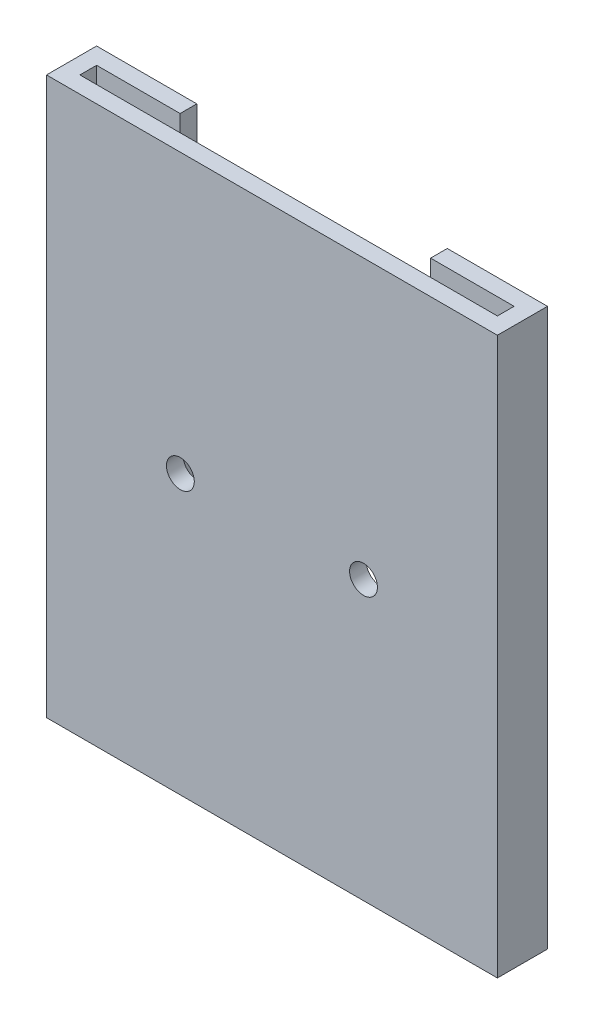
ISO-10303-21;
HEADER;
FILE_DESCRIPTION(('STEP AP214'),'2;1');
FILE_NAME('part.step','',(''),(''),'','','');
FILE_SCHEMA(('AUTOMOTIVE_DESIGN { 1 0 10303 214 1 1 1 1 }'));
ENDSEC;
DATA;
#1=APPLICATION_CONTEXT('core data for automotive mechanical design processes');
#2=APPLICATION_PROTOCOL_DEFINITION('international standard','automotive_design',2000,#1);
#3=PRODUCT_CONTEXT('',#1,'mechanical');
#4=PRODUCT('Part','Part','',(#3));
#5=PRODUCT_RELATED_PRODUCT_CATEGORY('part','',(#4));
#6=PRODUCT_DEFINITION_FORMATION('','',#4);
#7=PRODUCT_DEFINITION_CONTEXT('part definition',#1,'design');
#8=PRODUCT_DEFINITION('design','',#6,#7);
#9=PRODUCT_DEFINITION_SHAPE('','',#8);
#10=(LENGTH_UNIT() NAMED_UNIT(*) SI_UNIT(.MILLI.,.METRE.));
#11=(NAMED_UNIT(*) PLANE_ANGLE_UNIT() SI_UNIT($,.RADIAN.));
#12=(NAMED_UNIT(*) SI_UNIT($,.STERADIAN.) SOLID_ANGLE_UNIT());
#13=UNCERTAINTY_MEASURE_WITH_UNIT(LENGTH_MEASURE(1.E-05),#10,'distance_accuracy_value','');
#14=(GEOMETRIC_REPRESENTATION_CONTEXT(3) GLOBAL_UNCERTAINTY_ASSIGNED_CONTEXT((#13)) GLOBAL_UNIT_ASSIGNED_CONTEXT((#10,
#11,#12)) REPRESENTATION_CONTEXT('',''));
#15=CARTESIAN_POINT('',(0.,0.,0.));
#16=DIRECTION('',(0.,0.,1.));
#17=DIRECTION('',(1.,0.,0.));
#18=AXIS2_PLACEMENT_3D('',#15,#16,#17);
#19=CARTESIAN_POINT('',(-12.1747572815534,200.,0.));
#20=DIRECTION('',(1.,0.,0.));
#21=DIRECTION('',(0.,0.,-1.));
#22=AXIS2_PLACEMENT_3D('',#19,#20,#21);
#23=PLANE('',#22);
#24=DIRECTION('',(0.,0.,1.));
#25=VECTOR('',#24,1.);
#26=CARTESIAN_POINT('',(-12.1747572815534,0.,0.));
#27=LINE('',#26,#25);
#28=CARTESIAN_POINT('',(-12.1747572815534,0.,-6.));
#29=VERTEX_POINT('',#28);
#30=CARTESIAN_POINT('',(-12.1747572815534,0.,0.));
#31=VERTEX_POINT('',#30);
#32=EDGE_CURVE('E155',#29,#31,#27,.T.);
#33=ORIENTED_EDGE('',*,*,#32,.T.);
#34=DIRECTION('',(0.,-1.,0.));
#35=VECTOR('',#34,1.);
#36=CARTESIAN_POINT('',(-12.1747572815534,200.,0.));
#37=LINE('',#36,#35);
#38=CARTESIAN_POINT('',(-12.1747572815534,200.,0.));
#39=VERTEX_POINT('',#38);
#40=EDGE_CURVE('E11',#39,#31,#37,.T.);
#41=ORIENTED_EDGE('',*,*,#40,.F.);
#42=DIRECTION('',(0.,0.,1.));
#43=VECTOR('',#42,1.);
#44=CARTESIAN_POINT('',(-12.1747572815534,200.,0.));
#45=LINE('',#44,#43);
#46=CARTESIAN_POINT('',(-12.1747572815534,200.,-6.));
#47=VERTEX_POINT('',#46);
#48=EDGE_CURVE('E178',#47,#39,#45,.T.);
#49=ORIENTED_EDGE('',*,*,#48,.F.);
#50=DIRECTION('',(0.,-1.,0.));
#51=VECTOR('',#50,1.);
#52=CARTESIAN_POINT('',(-12.1747572815534,200.,-6.));
#53=LINE('',#52,#51);
#54=EDGE_CURVE('E151',#47,#29,#53,.T.);
#55=ORIENTED_EDGE('',*,*,#54,.T.);
#56=EDGE_LOOP('',(#33,#41,#49,#55));
#57=FACE_BOUND('',#56,.T.);
#58=ADVANCED_FACE('F35',(#57),#23,.F.);
#59=CARTESIAN_POINT('',(-12.1747572815534,200.,0.));
#60=DIRECTION('',(0.,0.,-1.));
#61=DIRECTION('',(-1.,0.,0.));
#62=AXIS2_PLACEMENT_3D('',#59,#60,#61);
#63=PLANE('',#62);
#64=DIRECTION('',(1.,0.,0.));
#65=VECTOR('',#64,1.);
#66=CARTESIAN_POINT('',(-12.1747572815534,0.,0.));
#67=LINE('',#66,#65);
#68=CARTESIAN_POINT('',(17.8252427184466,0.,0.));
#69=VERTEX_POINT('',#68);
#70=EDGE_CURVE('E158',#31,#69,#67,.T.);
#71=ORIENTED_EDGE('',*,*,#70,.T.);
#72=DIRECTION('',(0.,-1.,0.));
#73=VECTOR('',#72,1.);
#74=CARTESIAN_POINT('',(17.8252427184466,200.,0.));
#75=LINE('',#74,#73);
#76=CARTESIAN_POINT('',(17.8252427184466,200.,0.));
#77=VERTEX_POINT('',#76);
#78=EDGE_CURVE('E43',#77,#69,#75,.T.);
#79=ORIENTED_EDGE('',*,*,#78,.F.);
#80=DIRECTION('',(1.,0.,0.));
#81=VECTOR('',#80,1.);
#82=CARTESIAN_POINT('',(-12.1747572815534,200.,0.));
#83=LINE('',#82,#81);
#84=EDGE_CURVE('E106',#39,#77,#83,.T.);
#85=ORIENTED_EDGE('',*,*,#84,.F.);
#86=ORIENTED_EDGE('',*,*,#40,.T.);
#87=EDGE_LOOP('',(#71,#79,#85,#86));
#88=FACE_BOUND('',#87,.T.);
#89=ADVANCED_FACE('F256',(#88),#63,.F.);
#90=CARTESIAN_POINT('',(17.8252427184466,200.,0.));
#91=DIRECTION('',(1.,0.,0.));
#92=DIRECTION('',(0.,0.,-1.));
#93=AXIS2_PLACEMENT_3D('',#90,#91,#92);
#94=PLANE('',#93);
#95=DIRECTION('',(0.,0.,1.));
#96=VECTOR('',#95,1.);
#97=CARTESIAN_POINT('',(17.8252427184466,0.,0.));
#98=LINE('',#97,#96);
#99=CARTESIAN_POINT('',(17.8252427184466,0.,6.));
#100=VERTEX_POINT('',#99);
#101=EDGE_CURVE('E161',#69,#100,#98,.T.);
#102=ORIENTED_EDGE('',*,*,#101,.T.);
#103=DIRECTION('',(0.,-1.,0.));
#104=VECTOR('',#103,1.);
#105=CARTESIAN_POINT('',(17.8252427184466,200.,6.));
#106=LINE('',#105,#104);
#107=CARTESIAN_POINT('',(17.8252427184466,200.,6.));
#108=VERTEX_POINT('',#107);
#109=EDGE_CURVE('E197',#108,#100,#106,.T.);
#110=ORIENTED_EDGE('',*,*,#109,.F.);
#111=DIRECTION('',(0.,0.,1.));
#112=VECTOR('',#111,1.);
#113=CARTESIAN_POINT('',(17.8252427184466,200.,0.));
#114=LINE('',#113,#112);
#115=EDGE_CURVE('E205',#77,#108,#114,.T.);
#116=ORIENTED_EDGE('',*,*,#115,.F.);
#117=ORIENTED_EDGE('',*,*,#78,.T.);
#118=EDGE_LOOP('',(#102,#110,#116,#117));
#119=FACE_BOUND('',#118,.T.);
#120=ADVANCED_FACE('F203',(#119),#94,.F.);
#121=CARTESIAN_POINT('',(17.8252427184466,200.,6.));
#122=DIRECTION('',(0.,0.,1.));
#123=DIRECTION('',(1.,0.,0.));
#124=AXIS2_PLACEMENT_3D('',#121,#122,#123);
#125=PLANE('',#124);
#126=CARTESIAN_POINT('',(-24.2747572815534,100.,6.));
#127=DIRECTION('',(0.,0.,-1.));
#128=DIRECTION('',(-1.,0.,0.));
#129=AXIS2_PLACEMENT_3D('',#126,#127,#128);
#130=CIRCLE('',#129,5.);
#131=CARTESIAN_POINT('',(-29.2747572815534,100.,6.00000000000001));
#132=VERTEX_POINT('',#131);
#133=EDGE_CURVE('E293',#132,#132,#130,.T.);
#134=ORIENTED_EDGE('',*,*,#133,.F.);
#135=EDGE_LOOP('',(#134));
#136=FACE_BOUND('',#135,.T.);
#137=CARTESIAN_POINT('',(-90.0747572815533,100.,6.00000000000001));
#138=DIRECTION('',(0.,0.,-1.));
#139=DIRECTION('',(1.,0.,0.));
#140=AXIS2_PLACEMENT_3D('',#137,#138,#139);
#141=CIRCLE('',#140,5.00000000000001);
#142=CARTESIAN_POINT('',(-85.0747572815533,100.,6.00000000000001));
#143=VERTEX_POINT('',#142);
#144=EDGE_CURVE('E294',#143,#143,#141,.T.);
#145=ORIENTED_EDGE('',*,*,#144,.F.);
#146=EDGE_LOOP('',(#145));
#147=FACE_BOUND('',#146,.T.);
#148=DIRECTION('',(-1.,0.,0.));
#149=VECTOR('',#148,1.);
#150=CARTESIAN_POINT('',(17.8252427184466,0.,6.));
#151=LINE('',#150,#149);
#152=CARTESIAN_POINT('',(-132.174757281553,0.,6.00000000000002));
#153=VERTEX_POINT('',#152);
#154=EDGE_CURVE('E163',#100,#153,#151,.T.);
#155=ORIENTED_EDGE('',*,*,#154,.T.);
#156=DIRECTION('',(0.,-1.,0.));
#157=VECTOR('',#156,1.);
#158=CARTESIAN_POINT('',(-132.174757281553,200.,6.00000000000002));
#159=LINE('',#158,#157);
#160=CARTESIAN_POINT('',(-132.174757281553,200.,6.00000000000002));
#161=VERTEX_POINT('',#160);
#162=EDGE_CURVE('E194',#161,#153,#159,.T.);
#163=ORIENTED_EDGE('',*,*,#162,.F.);
#164=DIRECTION('',(-1.,0.,0.));
#165=VECTOR('',#164,1.);
#166=CARTESIAN_POINT('',(17.8252427184466,200.,6.));
#167=LINE('',#166,#165);
#168=EDGE_CURVE('E223',#108,#161,#167,.T.);
#169=ORIENTED_EDGE('',*,*,#168,.F.);
#170=ORIENTED_EDGE('',*,*,#109,.T.);
#171=EDGE_LOOP('',(#155,#163,#169,#170));
#172=FACE_BOUND('',#171,.T.);
#173=ADVANCED_FACE('F214',(#136,#147,#172),#125,.F.);
#174=CARTESIAN_POINT('',(-132.174757281553,200.,6.00000000000002));
#175=DIRECTION('',(-1.,0.,0.));
#176=DIRECTION('',(0.,0.,1.));
#177=AXIS2_PLACEMENT_3D('',#174,#175,#176);
#178=PLANE('',#177);
#179=DIRECTION('',(0.,0.,-1.));
#180=VECTOR('',#179,1.);
#181=CARTESIAN_POINT('',(-132.174757281553,0.,6.00000000000002));
#182=LINE('',#181,#180);
#183=CARTESIAN_POINT('',(-132.174757281553,0.,0.));
#184=VERTEX_POINT('',#183);
#185=EDGE_CURVE('E165',#153,#184,#182,.T.);
#186=ORIENTED_EDGE('',*,*,#185,.T.);
#187=DIRECTION('',(0.,-1.,0.));
#188=VECTOR('',#187,1.);
#189=CARTESIAN_POINT('',(-132.174757281553,200.,0.));
#190=LINE('',#189,#188);
#191=CARTESIAN_POINT('',(-132.174757281553,200.,0.));
#192=VERTEX_POINT('',#191);
#193=EDGE_CURVE('E191',#192,#184,#190,.T.);
#194=ORIENTED_EDGE('',*,*,#193,.F.);
#195=DIRECTION('',(0.,0.,-1.));
#196=VECTOR('',#195,1.);
#197=CARTESIAN_POINT('',(-132.174757281553,200.,6.00000000000002));
#198=LINE('',#197,#196);
#199=EDGE_CURVE('E220',#161,#192,#198,.T.);
#200=ORIENTED_EDGE('',*,*,#199,.F.);
#201=ORIENTED_EDGE('',*,*,#162,.T.);
#202=EDGE_LOOP('',(#186,#194,#200,#201));
#203=FACE_BOUND('',#202,.T.);
#204=ADVANCED_FACE('F218',(#203),#178,.F.);
#205=CARTESIAN_POINT('',(-102.174757281553,200.,0.));
#206=DIRECTION('',(0.,0.,-1.));
#207=DIRECTION('',(-1.,0.,0.));
#208=AXIS2_PLACEMENT_3D('',#205,#206,#207);
#209=PLANE('',#208);
#210=DIRECTION('',(1.,0.,0.));
#211=VECTOR('',#210,1.);
#212=CARTESIAN_POINT('',(-102.174757281553,0.,0.));
#213=LINE('',#212,#211);
#214=CARTESIAN_POINT('',(-102.174757281553,0.,0.));
#215=VERTEX_POINT('',#214);
#216=EDGE_CURVE('E167',#184,#215,#213,.T.);
#217=ORIENTED_EDGE('',*,*,#216,.T.);
#218=DIRECTION('',(0.,-1.,0.));
#219=VECTOR('',#218,1.);
#220=CARTESIAN_POINT('',(-102.174757281553,200.,0.));
#221=LINE('',#220,#219);
#222=CARTESIAN_POINT('',(-102.174757281553,200.,0.));
#223=VERTEX_POINT('',#222);
#224=EDGE_CURVE('E188',#223,#215,#221,.T.);
#225=ORIENTED_EDGE('',*,*,#224,.F.);
#226=DIRECTION('',(1.,0.,0.));
#227=VECTOR('',#226,1.);
#228=CARTESIAN_POINT('',(-102.174757281553,200.,0.));
#229=LINE('',#228,#227);
#230=EDGE_CURVE('E222',#192,#223,#229,.T.);
#231=ORIENTED_EDGE('',*,*,#230,.F.);
#232=ORIENTED_EDGE('',*,*,#193,.T.);
#233=EDGE_LOOP('',(#217,#225,#231,#232));
#234=FACE_BOUND('',#233,.T.);
#235=ADVANCED_FACE('F270',(#234),#209,.F.);
#236=CARTESIAN_POINT('',(-102.174757281553,200.,0.));
#237=DIRECTION('',(-1.,0.,0.));
#238=DIRECTION('',(0.,0.,1.));
#239=AXIS2_PLACEMENT_3D('',#236,#237,#238);
#240=PLANE('',#239);
#241=DIRECTION('',(0.,0.,-1.));
#242=VECTOR('',#241,1.);
#243=CARTESIAN_POINT('',(-102.174757281553,0.,0.));
#244=LINE('',#243,#242);
#245=CARTESIAN_POINT('',(-102.174757281553,0.,-6.));
#246=VERTEX_POINT('',#245);
#247=EDGE_CURVE('E169',#215,#246,#244,.T.);
#248=ORIENTED_EDGE('',*,*,#247,.T.);
#249=DIRECTION('',(0.,-1.,0.));
#250=VECTOR('',#249,1.);
#251=CARTESIAN_POINT('',(-102.174757281553,200.,-6.));
#252=LINE('',#251,#250);
#253=CARTESIAN_POINT('',(-102.174757281553,200.,-6.));
#254=VERTEX_POINT('',#253);
#255=EDGE_CURVE('E185',#254,#246,#252,.T.);
#256=ORIENTED_EDGE('',*,*,#255,.F.);
#257=DIRECTION('',(0.,0.,-1.));
#258=VECTOR('',#257,1.);
#259=CARTESIAN_POINT('',(-102.174757281553,200.,0.));
#260=LINE('',#259,#258);
#261=EDGE_CURVE('E225',#223,#254,#260,.T.);
#262=ORIENTED_EDGE('',*,*,#261,.F.);
#263=ORIENTED_EDGE('',*,*,#224,.T.);
#264=EDGE_LOOP('',(#248,#256,#262,#263));
#265=FACE_BOUND('',#264,.T.);
#266=ADVANCED_FACE('F273',(#265),#240,.F.);
#267=CARTESIAN_POINT('',(-102.174757281553,200.,-6.));
#268=DIRECTION('',(0.,0.,1.));
#269=DIRECTION('',(1.,0.,0.));
#270=AXIS2_PLACEMENT_3D('',#267,#268,#269);
#271=PLANE('',#270);
#272=DIRECTION('',(-1.,0.,0.));
#273=VECTOR('',#272,1.);
#274=CARTESIAN_POINT('',(-102.174757281553,0.,-6.));
#275=LINE('',#274,#273);
#276=CARTESIAN_POINT('',(-138.174757281553,0.,-6.));
#277=VERTEX_POINT('',#276);
#278=EDGE_CURVE('E171',#246,#277,#275,.T.);
#279=ORIENTED_EDGE('',*,*,#278,.T.);
#280=DIRECTION('',(0.,-1.,0.));
#281=VECTOR('',#280,1.);
#282=CARTESIAN_POINT('',(-138.174757281553,200.,-6.));
#283=LINE('',#282,#281);
#284=CARTESIAN_POINT('',(-138.174757281553,200.,-6.));
#285=VERTEX_POINT('',#284);
#286=EDGE_CURVE('E182',#285,#277,#283,.T.);
#287=ORIENTED_EDGE('',*,*,#286,.F.);
#288=DIRECTION('',(-1.,0.,0.));
#289=VECTOR('',#288,1.);
#290=CARTESIAN_POINT('',(-102.174757281553,200.,-6.));
#291=LINE('',#290,#289);
#292=EDGE_CURVE('E231',#254,#285,#291,.T.);
#293=ORIENTED_EDGE('',*,*,#292,.F.);
#294=ORIENTED_EDGE('',*,*,#255,.T.);
#295=EDGE_LOOP('',(#279,#287,#293,#294));
#296=FACE_BOUND('',#295,.T.);
#297=ADVANCED_FACE('F237',(#296),#271,.F.);
#298=CARTESIAN_POINT('',(-138.174757281553,200.,-6.));
#299=DIRECTION('',(1.,0.,0.));
#300=DIRECTION('',(0.,0.,-1.));
#301=AXIS2_PLACEMENT_3D('',#298,#299,#300);
#302=PLANE('',#301);
#303=DIRECTION('',(0.,0.,1.));
#304=VECTOR('',#303,1.);
#305=CARTESIAN_POINT('',(-138.174757281553,0.,-6.));
#306=LINE('',#305,#304);
#307=CARTESIAN_POINT('',(-138.174757281553,0.,12.));
#308=VERTEX_POINT('',#307);
#309=EDGE_CURVE('E173',#277,#308,#306,.T.);
#310=ORIENTED_EDGE('',*,*,#309,.T.);
#311=DIRECTION('',(0.,-1.,0.));
#312=VECTOR('',#311,1.);
#313=CARTESIAN_POINT('',(-138.174757281553,200.,12.));
#314=LINE('',#313,#312);
#315=CARTESIAN_POINT('',(-138.174757281553,200.,12.));
#316=VERTEX_POINT('',#315);
#317=EDGE_CURVE('E146',#316,#308,#314,.T.);
#318=ORIENTED_EDGE('',*,*,#317,.F.);
#319=DIRECTION('',(0.,0.,1.));
#320=VECTOR('',#319,1.);
#321=CARTESIAN_POINT('',(-138.174757281553,200.,-6.));
#322=LINE('',#321,#320);
#323=EDGE_CURVE('E137',#285,#316,#322,.T.);
#324=ORIENTED_EDGE('',*,*,#323,.F.);
#325=ORIENTED_EDGE('',*,*,#286,.T.);
#326=EDGE_LOOP('',(#310,#318,#324,#325));
#327=FACE_BOUND('',#326,.T.);
#328=ADVANCED_FACE('F241',(#327),#302,.F.);
#329=CARTESIAN_POINT('',(23.8252427184466,200.,12.));
#330=DIRECTION('',(0.,0.,-1.));
#331=DIRECTION('',(-1.,0.,0.));
#332=AXIS2_PLACEMENT_3D('',#329,#330,#331);
#333=PLANE('',#332);
#334=CARTESIAN_POINT('',(-24.2747572815534,100.,12.));
#335=DIRECTION('',(0.,0.,-1.));
#336=DIRECTION('',(-1.,0.,0.));
#337=AXIS2_PLACEMENT_3D('',#334,#335,#336);
#338=CIRCLE('',#337,5.);
#339=CARTESIAN_POINT('',(-29.2747572815534,100.,12.));
#340=VERTEX_POINT('',#339);
#341=EDGE_CURVE('E159',#340,#340,#338,.T.);
#342=ORIENTED_EDGE('',*,*,#341,.T.);
#343=EDGE_LOOP('',(#342));
#344=FACE_BOUND('',#343,.T.);
#345=CARTESIAN_POINT('',(-90.0747572815533,100.,12.));
#346=DIRECTION('',(0.,0.,-1.));
#347=DIRECTION('',(1.,0.,0.));
#348=AXIS2_PLACEMENT_3D('',#345,#346,#347);
#349=CIRCLE('',#348,5.00000000000001);
#350=CARTESIAN_POINT('',(-85.0747572815533,100.,12.));
#351=VERTEX_POINT('',#350);
#352=EDGE_CURVE('E291',#351,#351,#349,.T.);
#353=ORIENTED_EDGE('',*,*,#352,.T.);
#354=EDGE_LOOP('',(#353));
#355=FACE_BOUND('',#354,.T.);
#356=DIRECTION('',(1.,0.,0.));
#357=VECTOR('',#356,1.);
#358=CARTESIAN_POINT('',(23.8252427184466,0.,12.));
#359=LINE('',#358,#357);
#360=CARTESIAN_POINT('',(23.8252427184466,0.,12.));
#361=VERTEX_POINT('',#360);
#362=EDGE_CURVE('E145',#308,#361,#359,.T.);
#363=ORIENTED_EDGE('',*,*,#362,.T.);
#364=DIRECTION('',(0.,-1.,0.));
#365=VECTOR('',#364,1.);
#366=CARTESIAN_POINT('',(23.8252427184466,200.,12.));
#367=LINE('',#366,#365);
#368=CARTESIAN_POINT('',(23.8252427184466,200.,12.));
#369=VERTEX_POINT('',#368);
#370=EDGE_CURVE('E142',#369,#361,#367,.T.);
#371=ORIENTED_EDGE('',*,*,#370,.F.);
#372=DIRECTION('',(1.,0.,0.));
#373=VECTOR('',#372,1.);
#374=CARTESIAN_POINT('',(23.8252427184466,200.,12.));
#375=LINE('',#374,#373);
#376=EDGE_CURVE('E131',#316,#369,#375,.T.);
#377=ORIENTED_EDGE('',*,*,#376,.F.);
#378=ORIENTED_EDGE('',*,*,#317,.T.);
#379=EDGE_LOOP('',(#363,#371,#377,#378));
#380=FACE_BOUND('',#379,.T.);
#381=ADVANCED_FACE('F143',(#344,#355,#380),#333,.F.);
#382=CARTESIAN_POINT('',(23.8252427184466,200.,-6.));
#383=DIRECTION('',(-1.,0.,0.));
#384=DIRECTION('',(0.,0.,1.));
#385=AXIS2_PLACEMENT_3D('',#382,#383,#384);
#386=PLANE('',#385);
#387=DIRECTION('',(0.,0.,-1.));
#388=VECTOR('',#387,1.);
#389=CARTESIAN_POINT('',(23.8252427184466,0.,-6.));
#390=LINE('',#389,#388);
#391=CARTESIAN_POINT('',(23.8252427184466,0.,-6.));
#392=VERTEX_POINT('',#391);
#393=EDGE_CURVE('E92',#361,#392,#390,.T.);
#394=ORIENTED_EDGE('',*,*,#393,.T.);
#395=DIRECTION('',(0.,-1.,0.));
#396=VECTOR('',#395,1.);
#397=CARTESIAN_POINT('',(23.8252427184466,200.,-6.));
#398=LINE('',#397,#396);
#399=CARTESIAN_POINT('',(23.8252427184466,200.,-6.));
#400=VERTEX_POINT('',#399);
#401=EDGE_CURVE('E147',#400,#392,#398,.T.);
#402=ORIENTED_EDGE('',*,*,#401,.F.);
#403=DIRECTION('',(0.,0.,-1.));
#404=VECTOR('',#403,1.);
#405=CARTESIAN_POINT('',(23.8252427184466,200.,-6.));
#406=LINE('',#405,#404);
#407=EDGE_CURVE('E135',#369,#400,#406,.T.);
#408=ORIENTED_EDGE('',*,*,#407,.F.);
#409=ORIENTED_EDGE('',*,*,#370,.T.);
#410=EDGE_LOOP('',(#394,#402,#408,#409));
#411=FACE_BOUND('',#410,.T.);
#412=ADVANCED_FACE('F149',(#411),#386,.F.);
#413=CARTESIAN_POINT('',(-12.1747572815534,200.,-6.));
#414=DIRECTION('',(0.,0.,1.));
#415=DIRECTION('',(1.,0.,0.));
#416=AXIS2_PLACEMENT_3D('',#413,#414,#415);
#417=PLANE('',#416);
#418=DIRECTION('',(-1.,0.,0.));
#419=VECTOR('',#418,1.);
#420=CARTESIAN_POINT('',(-12.1747572815534,0.,-6.));
#421=LINE('',#420,#419);
#422=EDGE_CURVE('E98',#392,#29,#421,.T.);
#423=ORIENTED_EDGE('',*,*,#422,.T.);
#424=ORIENTED_EDGE('',*,*,#54,.F.);
#425=DIRECTION('',(-1.,0.,0.));
#426=VECTOR('',#425,1.);
#427=CARTESIAN_POINT('',(-12.1747572815534,200.,-6.));
#428=LINE('',#427,#426);
#429=EDGE_CURVE('E51',#400,#47,#428,.T.);
#430=ORIENTED_EDGE('',*,*,#429,.F.);
#431=ORIENTED_EDGE('',*,*,#401,.T.);
#432=EDGE_LOOP('',(#423,#424,#430,#431));
#433=FACE_BOUND('',#432,.T.);
#434=ADVANCED_FACE('F245',(#433),#417,.F.);
#435=CARTESIAN_POINT('',(0.,200.,0.));
#436=DIRECTION('',(0.,-1.,0.));
#437=DIRECTION('',(0.,0.,-1.));
#438=AXIS2_PLACEMENT_3D('',#435,#436,#437);
#439=PLANE('',#438);
#440=ORIENTED_EDGE('',*,*,#48,.T.);
#441=ORIENTED_EDGE('',*,*,#84,.T.);
#442=ORIENTED_EDGE('',*,*,#115,.T.);
#443=ORIENTED_EDGE('',*,*,#168,.T.);
#444=ORIENTED_EDGE('',*,*,#199,.T.);
#445=ORIENTED_EDGE('',*,*,#230,.T.);
#446=ORIENTED_EDGE('',*,*,#261,.T.);
#447=ORIENTED_EDGE('',*,*,#292,.T.);
#448=ORIENTED_EDGE('',*,*,#323,.T.);
#449=ORIENTED_EDGE('',*,*,#376,.T.);
#450=ORIENTED_EDGE('',*,*,#407,.T.);
#451=ORIENTED_EDGE('',*,*,#429,.T.);
#452=EDGE_LOOP('',(#440,#441,#442,#443,#444,#445,#446,#447,#448,#449,#450,#451));
#453=FACE_BOUND('',#452,.T.);
#454=ADVANCED_FACE('F133',(#453),#439,.F.);
#455=CARTESIAN_POINT('',(0.,0.,0.));
#456=DIRECTION('',(0.,-1.,0.));
#457=DIRECTION('',(0.,0.,-1.));
#458=AXIS2_PLACEMENT_3D('',#455,#456,#457);
#459=PLANE('',#458);
#460=ORIENTED_EDGE('',*,*,#32,.F.);
#461=ORIENTED_EDGE('',*,*,#422,.F.);
#462=ORIENTED_EDGE('',*,*,#393,.F.);
#463=ORIENTED_EDGE('',*,*,#362,.F.);
#464=ORIENTED_EDGE('',*,*,#309,.F.);
#465=ORIENTED_EDGE('',*,*,#278,.F.);
#466=ORIENTED_EDGE('',*,*,#247,.F.);
#467=ORIENTED_EDGE('',*,*,#216,.F.);
#468=ORIENTED_EDGE('',*,*,#185,.F.);
#469=ORIENTED_EDGE('',*,*,#154,.F.);
#470=ORIENTED_EDGE('',*,*,#101,.F.);
#471=ORIENTED_EDGE('',*,*,#70,.F.);
#472=EDGE_LOOP('',(#460,#461,#462,#463,#464,#465,#466,#467,#468,#469,#470,#471));
#473=FACE_BOUND('',#472,.T.);
#474=ADVANCED_FACE('F209',(#473),#459,.T.);
#475=CARTESIAN_POINT('',(-90.0747572815533,100.,12.));
#476=DIRECTION('',(0.,0.,-1.));
#477=DIRECTION('',(-1.,0.,0.));
#478=AXIS2_PLACEMENT_3D('',#475,#476,#477);
#479=CYLINDRICAL_SURFACE('',#478,5.00000000000001);
#480=ORIENTED_EDGE('',*,*,#352,.F.);
#481=EDGE_LOOP('',(#480));
#482=FACE_BOUND('',#481,.T.);
#483=ORIENTED_EDGE('',*,*,#144,.T.);
#484=EDGE_LOOP('',(#483));
#485=FACE_BOUND('',#484,.T.);
#486=ADVANCED_FACE('F305',(#482,#485),#479,.F.);
#487=CARTESIAN_POINT('',(-24.2747572815534,100.,12.));
#488=DIRECTION('',(0.,0.,-1.));
#489=DIRECTION('',(-1.,0.,0.));
#490=AXIS2_PLACEMENT_3D('',#487,#488,#489);
#491=CYLINDRICAL_SURFACE('',#490,5.);
#492=ORIENTED_EDGE('',*,*,#341,.F.);
#493=EDGE_LOOP('',(#492));
#494=FACE_BOUND('',#493,.T.);
#495=ORIENTED_EDGE('',*,*,#133,.T.);
#496=EDGE_LOOP('',(#495));
#497=FACE_BOUND('',#496,.T.);
#498=ADVANCED_FACE('F308',(#494,#497),#491,.F.);
#499=CLOSED_SHELL('',(#58,#89,#120,#173,#204,#235,#266,#297,#328,#381,#412,#434,#454,#474,#486,#498));
#500=MANIFOLD_SOLID_BREP('B2',#499);
#501=ADVANCED_BREP_SHAPE_REPRESENTATION('',(#18,#500),#14);
#502=SHAPE_DEFINITION_REPRESENTATION(#9,#501);
ENDSEC;
END-ISO-10303-21;
